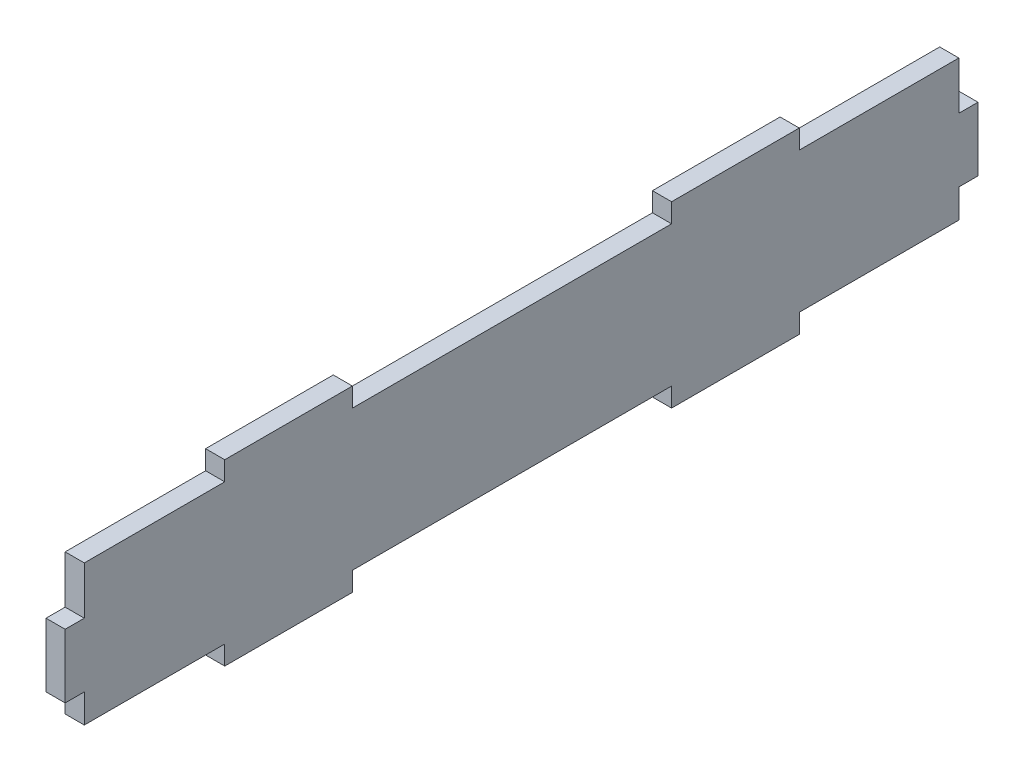
ISO-10303-21;
HEADER;
FILE_DESCRIPTION(('STEP AP214'),'2;1');
FILE_NAME('part.step','',(''),(''),'','','');
FILE_SCHEMA(('AUTOMOTIVE_DESIGN { 1 0 10303 214 1 1 1 1 }'));
ENDSEC;
DATA;
#1=APPLICATION_CONTEXT('core data for automotive mechanical design processes');
#2=APPLICATION_PROTOCOL_DEFINITION('international standard','automotive_design',2000,#1);
#3=PRODUCT_CONTEXT('',#1,'mechanical');
#4=PRODUCT('Part','Part','',(#3));
#5=PRODUCT_RELATED_PRODUCT_CATEGORY('part','',(#4));
#6=PRODUCT_DEFINITION_FORMATION('','',#4);
#7=PRODUCT_DEFINITION_CONTEXT('part definition',#1,'design');
#8=PRODUCT_DEFINITION('design','',#6,#7);
#9=PRODUCT_DEFINITION_SHAPE('','',#8);
#10=(LENGTH_UNIT() NAMED_UNIT(*) SI_UNIT(.MILLI.,.METRE.));
#11=(NAMED_UNIT(*) PLANE_ANGLE_UNIT() SI_UNIT($,.RADIAN.));
#12=(NAMED_UNIT(*) SI_UNIT($,.STERADIAN.) SOLID_ANGLE_UNIT());
#13=UNCERTAINTY_MEASURE_WITH_UNIT(LENGTH_MEASURE(1.E-05),#10,'distance_accuracy_value','');
#14=(GEOMETRIC_REPRESENTATION_CONTEXT(3) GLOBAL_UNCERTAINTY_ASSIGNED_CONTEXT((#13)) GLOBAL_UNIT_ASSIGNED_CONTEXT((#10,
#11,#12)) REPRESENTATION_CONTEXT('',''));
#15=CARTESIAN_POINT('',(0.,0.,0.));
#16=DIRECTION('',(0.,0.,1.));
#17=DIRECTION('',(1.,0.,0.));
#18=AXIS2_PLACEMENT_3D('',#15,#16,#17);
#19=CARTESIAN_POINT('',(135.739907326201,0.,0.));
#20=DIRECTION('',(0.,0.,-1.));
#21=DIRECTION('',(0.,1.,0.));
#22=AXIS2_PLACEMENT_3D('',#19,#20,#21);
#23=PLANE('',#22);
#24=DIRECTION('',(0.,-1.,0.));
#25=VECTOR('',#24,1.);
#26=CARTESIAN_POINT('',(132.739907326201,0.,0.));
#27=LINE('',#26,#25);
#28=CARTESIAN_POINT('',(132.739907326201,17.5,0.));
#29=VERTEX_POINT('',#28);
#30=CARTESIAN_POINT('',(132.739907326201,7.5,0.));
#31=VERTEX_POINT('',#30);
#32=EDGE_CURVE('E253',#29,#31,#27,.T.);
#33=ORIENTED_EDGE('',*,*,#32,.T.);
#34=DIRECTION('',(-1.,0.,0.));
#35=VECTOR('',#34,1.);
#36=CARTESIAN_POINT('',(135.739907326201,7.5,0.));
#37=LINE('',#36,#35);
#38=CARTESIAN_POINT('',(135.739907326201,7.5,0.));
#39=VERTEX_POINT('',#38);
#40=EDGE_CURVE('E11',#39,#31,#37,.T.);
#41=ORIENTED_EDGE('',*,*,#40,.F.);
#42=DIRECTION('',(0.,-1.,0.));
#43=VECTOR('',#42,1.);
#44=CARTESIAN_POINT('',(135.739907326201,0.,0.));
#45=LINE('',#44,#43);
#46=CARTESIAN_POINT('',(135.739907326201,17.5,0.));
#47=VERTEX_POINT('',#46);
#48=EDGE_CURVE('E327',#47,#39,#45,.T.);
#49=ORIENTED_EDGE('',*,*,#48,.F.);
#50=DIRECTION('',(-1.,0.,0.));
#51=VECTOR('',#50,1.);
#52=CARTESIAN_POINT('',(135.739907326201,17.5,0.));
#53=LINE('',#52,#51);
#54=EDGE_CURVE('E50',#47,#29,#53,.T.);
#55=ORIENTED_EDGE('',*,*,#54,.T.);
#56=EDGE_LOOP('',(#33,#41,#49,#55));
#57=FACE_BOUND('',#56,.T.);
#58=ADVANCED_FACE('F34',(#57),#23,.F.);
#59=CARTESIAN_POINT('',(135.739907326201,7.5,0.));
#60=DIRECTION('',(0.,1.,0.));
#61=DIRECTION('',(0.,0.,1.));
#62=AXIS2_PLACEMENT_3D('',#59,#60,#61);
#63=PLANE('',#62);
#64=DIRECTION('',(0.,0.,-1.));
#65=VECTOR('',#64,1.);
#66=CARTESIAN_POINT('',(132.739907326201,7.5,0.));
#67=LINE('',#66,#65);
#68=CARTESIAN_POINT('',(132.739907326201,7.5,-3.00000000000002));
#69=VERTEX_POINT('',#68);
#70=EDGE_CURVE('E255',#31,#69,#67,.T.);
#71=ORIENTED_EDGE('',*,*,#70,.T.);
#72=DIRECTION('',(-1.,0.,0.));
#73=VECTOR('',#72,1.);
#74=CARTESIAN_POINT('',(135.739907326201,7.5,-3.00000000000002));
#75=LINE('',#74,#73);
#76=CARTESIAN_POINT('',(135.739907326201,7.5,-3.00000000000002));
#77=VERTEX_POINT('',#76);
#78=EDGE_CURVE('E42',#77,#69,#75,.T.);
#79=ORIENTED_EDGE('',*,*,#78,.F.);
#80=DIRECTION('',(0.,0.,-1.));
#81=VECTOR('',#80,1.);
#82=CARTESIAN_POINT('',(135.739907326201,7.5,0.));
#83=LINE('',#82,#81);
#84=EDGE_CURVE('E149',#39,#77,#83,.T.);
#85=ORIENTED_EDGE('',*,*,#84,.F.);
#86=ORIENTED_EDGE('',*,*,#40,.T.);
#87=EDGE_LOOP('',(#71,#79,#85,#86));
#88=FACE_BOUND('',#87,.T.);
#89=ADVANCED_FACE('F472',(#88),#63,.F.);
#90=CARTESIAN_POINT('',(135.739907326201,0.,-3.00000000000002));
#91=DIRECTION('',(0.,0.,-1.));
#92=DIRECTION('',(-1.,0.,0.));
#93=AXIS2_PLACEMENT_3D('',#90,#91,#92);
#94=PLANE('',#93);
#95=DIRECTION('',(0.,-1.,0.));
#96=VECTOR('',#95,1.);
#97=CARTESIAN_POINT('',(132.739907326201,0.,-3.00000000000002));
#98=LINE('',#97,#96);
#99=CARTESIAN_POINT('',(132.739907326201,3.,-3.00000000000002));
#100=VERTEX_POINT('',#99);
#101=EDGE_CURVE('E257',#69,#100,#98,.T.);
#102=ORIENTED_EDGE('',*,*,#101,.T.);
#103=DIRECTION('',(-1.,0.,0.));
#104=VECTOR('',#103,1.);
#105=CARTESIAN_POINT('',(135.739907326201,3.,-3.00000000000002));
#106=LINE('',#105,#104);
#107=CARTESIAN_POINT('',(135.739907326201,3.,-3.00000000000002));
#108=VERTEX_POINT('',#107);
#109=EDGE_CURVE('E377',#108,#100,#106,.T.);
#110=ORIENTED_EDGE('',*,*,#109,.F.);
#111=DIRECTION('',(0.,-1.,0.));
#112=VECTOR('',#111,1.);
#113=CARTESIAN_POINT('',(135.739907326201,0.,-3.00000000000002));
#114=LINE('',#113,#112);
#115=EDGE_CURVE('E385',#77,#108,#114,.T.);
#116=ORIENTED_EDGE('',*,*,#115,.F.);
#117=ORIENTED_EDGE('',*,*,#78,.T.);
#118=EDGE_LOOP('',(#102,#110,#116,#117));
#119=FACE_BOUND('',#118,.T.);
#120=ADVANCED_FACE('F383',(#119),#94,.F.);
#121=CARTESIAN_POINT('',(135.739907326201,3.,0.));
#122=DIRECTION('',(0.,1.,0.));
#123=DIRECTION('',(0.,0.,1.));
#124=AXIS2_PLACEMENT_3D('',#121,#122,#123);
#125=PLANE('',#124);
#126=DIRECTION('',(0.,0.,-1.));
#127=VECTOR('',#126,1.);
#128=CARTESIAN_POINT('',(132.739907326201,3.,0.));
#129=LINE('',#128,#127);
#130=CARTESIAN_POINT('',(132.739907326201,3.,-25.));
#131=VERTEX_POINT('',#130);
#132=EDGE_CURVE('E259',#100,#131,#129,.T.);
#133=ORIENTED_EDGE('',*,*,#132,.T.);
#134=DIRECTION('',(-1.,0.,0.));
#135=VECTOR('',#134,1.);
#136=CARTESIAN_POINT('',(135.739907326201,3.,-25.));
#137=LINE('',#136,#135);
#138=CARTESIAN_POINT('',(135.739907326201,3.,-25.));
#139=VERTEX_POINT('',#138);
#140=EDGE_CURVE('E375',#139,#131,#137,.T.);
#141=ORIENTED_EDGE('',*,*,#140,.F.);
#142=DIRECTION('',(0.,0.,-1.));
#143=VECTOR('',#142,1.);
#144=CARTESIAN_POINT('',(135.739907326201,3.,0.));
#145=LINE('',#144,#143);
#146=EDGE_CURVE('E396',#108,#139,#145,.T.);
#147=ORIENTED_EDGE('',*,*,#146,.F.);
#148=ORIENTED_EDGE('',*,*,#109,.T.);
#149=EDGE_LOOP('',(#133,#141,#147,#148));
#150=FACE_BOUND('',#149,.T.);
#151=ADVANCED_FACE('F393',(#150),#125,.F.);
#152=CARTESIAN_POINT('',(135.739907326201,0.,-25.));
#153=DIRECTION('',(0.,0.,1.));
#154=DIRECTION('',(1.,0.,0.));
#155=AXIS2_PLACEMENT_3D('',#152,#153,#154);
#156=PLANE('',#155);
#157=DIRECTION('',(0.,1.,0.));
#158=VECTOR('',#157,1.);
#159=CARTESIAN_POINT('',(132.739907326201,0.,-25.));
#160=LINE('',#159,#158);
#161=CARTESIAN_POINT('',(132.739907326201,0.,-25.));
#162=VERTEX_POINT('',#161);
#163=EDGE_CURVE('E262',#162,#131,#160,.T.);
#164=ORIENTED_EDGE('',*,*,#163,.F.);
#165=DIRECTION('',(-1.,0.,0.));
#166=VECTOR('',#165,1.);
#167=CARTESIAN_POINT('',(135.739907326201,0.,-25.));
#168=LINE('',#167,#166);
#169=CARTESIAN_POINT('',(135.739907326201,0.,-25.));
#170=VERTEX_POINT('',#169);
#171=EDGE_CURVE('E373',#170,#162,#168,.T.);
#172=ORIENTED_EDGE('',*,*,#171,.F.);
#173=DIRECTION('',(0.,1.,0.));
#174=VECTOR('',#173,1.);
#175=CARTESIAN_POINT('',(135.739907326201,0.,-25.));
#176=LINE('',#175,#174);
#177=EDGE_CURVE('E398',#170,#139,#176,.T.);
#178=ORIENTED_EDGE('',*,*,#177,.T.);
#179=ORIENTED_EDGE('',*,*,#140,.T.);
#180=EDGE_LOOP('',(#164,#172,#178,#179));
#181=FACE_BOUND('',#180,.T.);
#182=ADVANCED_FACE('F667',(#181),#156,.T.);
#183=CARTESIAN_POINT('',(135.739907326201,0.,0.));
#184=DIRECTION('',(0.,1.,0.));
#185=DIRECTION('',(0.,0.,1.));
#186=AXIS2_PLACEMENT_3D('',#183,#184,#185);
#187=PLANE('',#186);
#188=DIRECTION('',(0.,0.,-1.));
#189=VECTOR('',#188,1.);
#190=CARTESIAN_POINT('',(132.739907326201,0.,0.));
#191=LINE('',#190,#189);
#192=CARTESIAN_POINT('',(132.739907326201,0.,-45.));
#193=VERTEX_POINT('',#192);
#194=EDGE_CURVE('E265',#162,#193,#191,.T.);
#195=ORIENTED_EDGE('',*,*,#194,.T.);
#196=DIRECTION('',(-1.,0.,0.));
#197=VECTOR('',#196,1.);
#198=CARTESIAN_POINT('',(135.739907326201,0.,-45.));
#199=LINE('',#198,#197);
#200=CARTESIAN_POINT('',(135.739907326201,0.,-45.));
#201=VERTEX_POINT('',#200);
#202=EDGE_CURVE('E370',#201,#193,#199,.T.);
#203=ORIENTED_EDGE('',*,*,#202,.F.);
#204=DIRECTION('',(0.,0.,-1.));
#205=VECTOR('',#204,1.);
#206=CARTESIAN_POINT('',(135.739907326201,0.,0.));
#207=LINE('',#206,#205);
#208=EDGE_CURVE('E400',#170,#201,#207,.T.);
#209=ORIENTED_EDGE('',*,*,#208,.F.);
#210=ORIENTED_EDGE('',*,*,#171,.T.);
#211=EDGE_LOOP('',(#195,#203,#209,#210));
#212=FACE_BOUND('',#211,.T.);
#213=ADVANCED_FACE('F658',(#212),#187,.F.);
#214=CARTESIAN_POINT('',(135.739907326201,0.,-45.));
#215=DIRECTION('',(0.,0.,1.));
#216=DIRECTION('',(1.,0.,0.));
#217=AXIS2_PLACEMENT_3D('',#214,#215,#216);
#218=PLANE('',#217);
#219=DIRECTION('',(0.,1.,0.));
#220=VECTOR('',#219,1.);
#221=CARTESIAN_POINT('',(132.739907326201,0.,-45.));
#222=LINE('',#221,#220);
#223=CARTESIAN_POINT('',(132.739907326201,3.,-45.));
#224=VERTEX_POINT('',#223);
#225=EDGE_CURVE('E267',#193,#224,#222,.T.);
#226=ORIENTED_EDGE('',*,*,#225,.T.);
#227=DIRECTION('',(-1.,0.,0.));
#228=VECTOR('',#227,1.);
#229=CARTESIAN_POINT('',(135.739907326201,3.,-45.));
#230=LINE('',#229,#228);
#231=CARTESIAN_POINT('',(135.739907326201,3.,-45.));
#232=VERTEX_POINT('',#231);
#233=EDGE_CURVE('E367',#232,#224,#230,.T.);
#234=ORIENTED_EDGE('',*,*,#233,.F.);
#235=DIRECTION('',(0.,1.,0.));
#236=VECTOR('',#235,1.);
#237=CARTESIAN_POINT('',(135.739907326201,0.,-45.));
#238=LINE('',#237,#236);
#239=EDGE_CURVE('E406',#201,#232,#238,.T.);
#240=ORIENTED_EDGE('',*,*,#239,.F.);
#241=ORIENTED_EDGE('',*,*,#202,.T.);
#242=EDGE_LOOP('',(#226,#234,#240,#241));
#243=FACE_BOUND('',#242,.T.);
#244=ADVANCED_FACE('F649',(#243),#218,.F.);
#245=CARTESIAN_POINT('',(135.739907326201,3.,0.));
#246=DIRECTION('',(0.,1.,0.));
#247=DIRECTION('',(0.,0.,1.));
#248=AXIS2_PLACEMENT_3D('',#245,#246,#247);
#249=PLANE('',#248);
#250=DIRECTION('',(0.,0.,-1.));
#251=VECTOR('',#250,1.);
#252=CARTESIAN_POINT('',(132.739907326201,3.,0.));
#253=LINE('',#252,#251);
#254=CARTESIAN_POINT('',(132.739907326201,3.,-95.));
#255=VERTEX_POINT('',#254);
#256=EDGE_CURVE('E269',#224,#255,#253,.T.);
#257=ORIENTED_EDGE('',*,*,#256,.T.);
#258=DIRECTION('',(-1.,0.,0.));
#259=VECTOR('',#258,1.);
#260=CARTESIAN_POINT('',(135.739907326201,3.,-95.));
#261=LINE('',#260,#259);
#262=CARTESIAN_POINT('',(135.739907326201,3.,-95.));
#263=VERTEX_POINT('',#262);
#264=EDGE_CURVE('E365',#263,#255,#261,.T.);
#265=ORIENTED_EDGE('',*,*,#264,.F.);
#266=DIRECTION('',(0.,0.,-1.));
#267=VECTOR('',#266,1.);
#268=CARTESIAN_POINT('',(135.739907326201,3.,0.));
#269=LINE('',#268,#267);
#270=EDGE_CURVE('E408',#232,#263,#269,.T.);
#271=ORIENTED_EDGE('',*,*,#270,.F.);
#272=ORIENTED_EDGE('',*,*,#233,.T.);
#273=EDGE_LOOP('',(#257,#265,#271,#272));
#274=FACE_BOUND('',#273,.T.);
#275=ADVANCED_FACE('F640',(#274),#249,.F.);
#276=CARTESIAN_POINT('',(135.739907326201,0.,-95.));
#277=DIRECTION('',(0.,0.,1.));
#278=DIRECTION('',(1.,0.,0.));
#279=AXIS2_PLACEMENT_3D('',#276,#277,#278);
#280=PLANE('',#279);
#281=DIRECTION('',(0.,1.,0.));
#282=VECTOR('',#281,1.);
#283=CARTESIAN_POINT('',(132.739907326201,0.,-95.));
#284=LINE('',#283,#282);
#285=CARTESIAN_POINT('',(132.739907326201,0.,-95.));
#286=VERTEX_POINT('',#285);
#287=EDGE_CURVE('E272',#286,#255,#284,.T.);
#288=ORIENTED_EDGE('',*,*,#287,.F.);
#289=DIRECTION('',(-1.,0.,0.));
#290=VECTOR('',#289,1.);
#291=CARTESIAN_POINT('',(135.739907326201,0.,-95.));
#292=LINE('',#291,#290);
#293=CARTESIAN_POINT('',(135.739907326201,0.,-95.));
#294=VERTEX_POINT('',#293);
#295=EDGE_CURVE('E363',#294,#286,#292,.T.);
#296=ORIENTED_EDGE('',*,*,#295,.F.);
#297=DIRECTION('',(0.,1.,0.));
#298=VECTOR('',#297,1.);
#299=CARTESIAN_POINT('',(135.739907326201,0.,-95.));
#300=LINE('',#299,#298);
#301=EDGE_CURVE('E410',#294,#263,#300,.T.);
#302=ORIENTED_EDGE('',*,*,#301,.T.);
#303=ORIENTED_EDGE('',*,*,#264,.T.);
#304=EDGE_LOOP('',(#288,#296,#302,#303));
#305=FACE_BOUND('',#304,.T.);
#306=ADVANCED_FACE('F631',(#305),#280,.T.);
#307=CARTESIAN_POINT('',(135.739907326201,0.,0.));
#308=DIRECTION('',(0.,1.,0.));
#309=DIRECTION('',(0.,0.,1.));
#310=AXIS2_PLACEMENT_3D('',#307,#308,#309);
#311=PLANE('',#310);
#312=DIRECTION('',(0.,0.,-1.));
#313=VECTOR('',#312,1.);
#314=CARTESIAN_POINT('',(132.739907326201,0.,0.));
#315=LINE('',#314,#313);
#316=CARTESIAN_POINT('',(132.739907326201,0.,-115.));
#317=VERTEX_POINT('',#316);
#318=EDGE_CURVE('E275',#286,#317,#315,.T.);
#319=ORIENTED_EDGE('',*,*,#318,.T.);
#320=DIRECTION('',(-1.,0.,0.));
#321=VECTOR('',#320,1.);
#322=CARTESIAN_POINT('',(135.739907326201,0.,-115.));
#323=LINE('',#322,#321);
#324=CARTESIAN_POINT('',(135.739907326201,0.,-115.));
#325=VERTEX_POINT('',#324);
#326=EDGE_CURVE('E360',#325,#317,#323,.T.);
#327=ORIENTED_EDGE('',*,*,#326,.F.);
#328=DIRECTION('',(0.,0.,-1.));
#329=VECTOR('',#328,1.);
#330=CARTESIAN_POINT('',(135.739907326201,0.,0.));
#331=LINE('',#330,#329);
#332=EDGE_CURVE('E413',#294,#325,#331,.T.);
#333=ORIENTED_EDGE('',*,*,#332,.F.);
#334=ORIENTED_EDGE('',*,*,#295,.T.);
#335=EDGE_LOOP('',(#319,#327,#333,#334));
#336=FACE_BOUND('',#335,.T.);
#337=ADVANCED_FACE('F622',(#336),#311,.F.);
#338=CARTESIAN_POINT('',(135.739907326201,0.,-115.));
#339=DIRECTION('',(0.,0.,1.));
#340=DIRECTION('',(1.,0.,0.));
#341=AXIS2_PLACEMENT_3D('',#338,#339,#340);
#342=PLANE('',#341);
#343=DIRECTION('',(0.,1.,0.));
#344=VECTOR('',#343,1.);
#345=CARTESIAN_POINT('',(132.739907326201,0.,-115.));
#346=LINE('',#345,#344);
#347=CARTESIAN_POINT('',(132.739907326201,3.,-115.));
#348=VERTEX_POINT('',#347);
#349=EDGE_CURVE('E277',#317,#348,#346,.T.);
#350=ORIENTED_EDGE('',*,*,#349,.T.);
#351=DIRECTION('',(-1.,0.,0.));
#352=VECTOR('',#351,1.);
#353=CARTESIAN_POINT('',(135.739907326201,3.,-115.));
#354=LINE('',#353,#352);
#355=CARTESIAN_POINT('',(135.739907326201,3.,-115.));
#356=VERTEX_POINT('',#355);
#357=EDGE_CURVE('E357',#356,#348,#354,.T.);
#358=ORIENTED_EDGE('',*,*,#357,.F.);
#359=DIRECTION('',(0.,1.,0.));
#360=VECTOR('',#359,1.);
#361=CARTESIAN_POINT('',(135.739907326201,0.,-115.));
#362=LINE('',#361,#360);
#363=EDGE_CURVE('E415',#325,#356,#362,.T.);
#364=ORIENTED_EDGE('',*,*,#363,.F.);
#365=ORIENTED_EDGE('',*,*,#326,.T.);
#366=EDGE_LOOP('',(#350,#358,#364,#365));
#367=FACE_BOUND('',#366,.T.);
#368=ADVANCED_FACE('F613',(#367),#342,.F.);
#369=CARTESIAN_POINT('',(135.739907326201,3.,0.));
#370=DIRECTION('',(0.,1.,0.));
#371=DIRECTION('',(0.,0.,1.));
#372=AXIS2_PLACEMENT_3D('',#369,#370,#371);
#373=PLANE('',#372);
#374=DIRECTION('',(0.,0.,-1.));
#375=VECTOR('',#374,1.);
#376=CARTESIAN_POINT('',(132.739907326201,3.,0.));
#377=LINE('',#376,#375);
#378=CARTESIAN_POINT('',(132.739907326201,3.,-140.));
#379=VERTEX_POINT('',#378);
#380=EDGE_CURVE('E279',#348,#379,#377,.T.);
#381=ORIENTED_EDGE('',*,*,#380,.T.);
#382=DIRECTION('',(-1.,0.,0.));
#383=VECTOR('',#382,1.);
#384=CARTESIAN_POINT('',(135.739907326201,3.,-140.));
#385=LINE('',#384,#383);
#386=CARTESIAN_POINT('',(135.739907326201,3.,-140.));
#387=VERTEX_POINT('',#386);
#388=EDGE_CURVE('E355',#387,#379,#385,.T.);
#389=ORIENTED_EDGE('',*,*,#388,.F.);
#390=DIRECTION('',(0.,0.,-1.));
#391=VECTOR('',#390,1.);
#392=CARTESIAN_POINT('',(135.739907326201,3.,0.));
#393=LINE('',#392,#391);
#394=EDGE_CURVE('E417',#356,#387,#393,.T.);
#395=ORIENTED_EDGE('',*,*,#394,.F.);
#396=ORIENTED_EDGE('',*,*,#357,.T.);
#397=EDGE_LOOP('',(#381,#389,#395,#396));
#398=FACE_BOUND('',#397,.T.);
#399=ADVANCED_FACE('F604',(#398),#373,.F.);
#400=CARTESIAN_POINT('',(135.739907326201,0.,-140.));
#401=DIRECTION('',(0.,0.,-1.));
#402=DIRECTION('',(-1.,0.,0.));
#403=AXIS2_PLACEMENT_3D('',#400,#401,#402);
#404=PLANE('',#403);
#405=DIRECTION('',(0.,-1.,0.));
#406=VECTOR('',#405,1.);
#407=CARTESIAN_POINT('',(132.739907326201,0.,-140.));
#408=LINE('',#407,#406);
#409=CARTESIAN_POINT('',(132.739907326201,7.5,-140.));
#410=VERTEX_POINT('',#409);
#411=EDGE_CURVE('E282',#410,#379,#408,.T.);
#412=ORIENTED_EDGE('',*,*,#411,.F.);
#413=DIRECTION('',(-1.,0.,0.));
#414=VECTOR('',#413,1.);
#415=CARTESIAN_POINT('',(135.739907326201,7.5,-140.));
#416=LINE('',#415,#414);
#417=CARTESIAN_POINT('',(135.739907326201,7.5,-140.));
#418=VERTEX_POINT('',#417);
#419=EDGE_CURVE('E353',#418,#410,#416,.T.);
#420=ORIENTED_EDGE('',*,*,#419,.F.);
#421=DIRECTION('',(0.,-1.,0.));
#422=VECTOR('',#421,1.);
#423=CARTESIAN_POINT('',(135.739907326201,0.,-140.));
#424=LINE('',#423,#422);
#425=EDGE_CURVE('E419',#418,#387,#424,.T.);
#426=ORIENTED_EDGE('',*,*,#425,.T.);
#427=ORIENTED_EDGE('',*,*,#388,.T.);
#428=EDGE_LOOP('',(#412,#420,#426,#427));
#429=FACE_BOUND('',#428,.T.);
#430=ADVANCED_FACE('F595',(#429),#404,.T.);
#431=CARTESIAN_POINT('',(135.739907326201,7.49999999999996,0.));
#432=DIRECTION('',(0.,-1.,0.));
#433=DIRECTION('',(0.,0.,-1.));
#434=AXIS2_PLACEMENT_3D('',#431,#432,#433);
#435=PLANE('',#434);
#436=DIRECTION('',(0.,0.,1.));
#437=VECTOR('',#436,1.);
#438=CARTESIAN_POINT('',(132.739907326201,7.49999999999996,0.));
#439=LINE('',#438,#437);
#440=CARTESIAN_POINT('',(132.739907326201,7.5,-143.));
#441=VERTEX_POINT('',#440);
#442=EDGE_CURVE('E285',#441,#410,#439,.T.);
#443=ORIENTED_EDGE('',*,*,#442,.F.);
#444=DIRECTION('',(-1.,0.,0.));
#445=VECTOR('',#444,1.);
#446=CARTESIAN_POINT('',(135.739907326201,7.5,-143.));
#447=LINE('',#446,#445);
#448=CARTESIAN_POINT('',(135.739907326201,7.5,-143.));
#449=VERTEX_POINT('',#448);
#450=EDGE_CURVE('E351',#449,#441,#447,.T.);
#451=ORIENTED_EDGE('',*,*,#450,.F.);
#452=DIRECTION('',(0.,0.,1.));
#453=VECTOR('',#452,1.);
#454=CARTESIAN_POINT('',(135.739907326201,7.49999999999996,0.));
#455=LINE('',#454,#453);
#456=EDGE_CURVE('E422',#449,#418,#455,.T.);
#457=ORIENTED_EDGE('',*,*,#456,.T.);
#458=ORIENTED_EDGE('',*,*,#419,.T.);
#459=EDGE_LOOP('',(#443,#451,#457,#458));
#460=FACE_BOUND('',#459,.T.);
#461=ADVANCED_FACE('F586',(#460),#435,.T.);
#462=CARTESIAN_POINT('',(135.739907326201,0.,-143.));
#463=DIRECTION('',(0.,0.,-1.));
#464=DIRECTION('',(-1.,0.,0.));
#465=AXIS2_PLACEMENT_3D('',#462,#463,#464);
#466=PLANE('',#465);
#467=DIRECTION('',(0.,-1.,0.));
#468=VECTOR('',#467,1.);
#469=CARTESIAN_POINT('',(132.739907326201,0.,-143.));
#470=LINE('',#469,#468);
#471=CARTESIAN_POINT('',(132.739907326201,17.5,-143.));
#472=VERTEX_POINT('',#471);
#473=EDGE_CURVE('E288',#472,#441,#470,.T.);
#474=ORIENTED_EDGE('',*,*,#473,.F.);
#475=DIRECTION('',(-1.,0.,0.));
#476=VECTOR('',#475,1.);
#477=CARTESIAN_POINT('',(135.739907326201,17.5,-143.));
#478=LINE('',#477,#476);
#479=CARTESIAN_POINT('',(135.739907326201,17.5,-143.));
#480=VERTEX_POINT('',#479);
#481=EDGE_CURVE('E349',#480,#472,#478,.T.);
#482=ORIENTED_EDGE('',*,*,#481,.F.);
#483=DIRECTION('',(0.,-1.,0.));
#484=VECTOR('',#483,1.);
#485=CARTESIAN_POINT('',(135.739907326201,0.,-143.));
#486=LINE('',#485,#484);
#487=EDGE_CURVE('E425',#480,#449,#486,.T.);
#488=ORIENTED_EDGE('',*,*,#487,.T.);
#489=ORIENTED_EDGE('',*,*,#450,.T.);
#490=EDGE_LOOP('',(#474,#482,#488,#489));
#491=FACE_BOUND('',#490,.T.);
#492=ADVANCED_FACE('F576',(#491),#466,.T.);
#493=CARTESIAN_POINT('',(135.739907326201,17.5,0.));
#494=DIRECTION('',(0.,1.,0.));
#495=DIRECTION('',(0.,0.,1.));
#496=AXIS2_PLACEMENT_3D('',#493,#494,#495);
#497=PLANE('',#496);
#498=DIRECTION('',(0.,0.,-1.));
#499=VECTOR('',#498,1.);
#500=CARTESIAN_POINT('',(132.739907326201,17.5,0.));
#501=LINE('',#500,#499);
#502=CARTESIAN_POINT('',(132.739907326201,17.5,-140.));
#503=VERTEX_POINT('',#502);
#504=EDGE_CURVE('E291',#503,#472,#501,.T.);
#505=ORIENTED_EDGE('',*,*,#504,.F.);
#506=DIRECTION('',(-1.,0.,0.));
#507=VECTOR('',#506,1.);
#508=CARTESIAN_POINT('',(135.739907326201,17.5,-140.));
#509=LINE('',#508,#507);
#510=CARTESIAN_POINT('',(135.739907326201,17.5,-140.));
#511=VERTEX_POINT('',#510);
#512=EDGE_CURVE('E347',#511,#503,#509,.T.);
#513=ORIENTED_EDGE('',*,*,#512,.F.);
#514=DIRECTION('',(0.,0.,-1.));
#515=VECTOR('',#514,1.);
#516=CARTESIAN_POINT('',(135.739907326201,17.5,0.));
#517=LINE('',#516,#515);
#518=EDGE_CURVE('E428',#511,#480,#517,.T.);
#519=ORIENTED_EDGE('',*,*,#518,.T.);
#520=ORIENTED_EDGE('',*,*,#481,.T.);
#521=EDGE_LOOP('',(#505,#513,#519,#520));
#522=FACE_BOUND('',#521,.T.);
#523=ADVANCED_FACE('F567',(#522),#497,.T.);
#524=CARTESIAN_POINT('',(135.739907326201,0.,-140.));
#525=DIRECTION('',(0.,0.,-1.));
#526=DIRECTION('',(-1.,0.,0.));
#527=AXIS2_PLACEMENT_3D('',#524,#525,#526);
#528=PLANE('',#527);
#529=DIRECTION('',(0.,-1.,0.));
#530=VECTOR('',#529,1.);
#531=CARTESIAN_POINT('',(132.739907326201,0.,-140.));
#532=LINE('',#531,#530);
#533=CARTESIAN_POINT('',(132.739907326201,25.,-140.));
#534=VERTEX_POINT('',#533);
#535=EDGE_CURVE('E294',#534,#503,#532,.T.);
#536=ORIENTED_EDGE('',*,*,#535,.F.);
#537=DIRECTION('',(-1.,0.,0.));
#538=VECTOR('',#537,1.);
#539=CARTESIAN_POINT('',(135.739907326201,25.,-140.));
#540=LINE('',#539,#538);
#541=CARTESIAN_POINT('',(135.739907326201,25.,-140.));
#542=VERTEX_POINT('',#541);
#543=EDGE_CURVE('E345',#542,#534,#540,.T.);
#544=ORIENTED_EDGE('',*,*,#543,.F.);
#545=DIRECTION('',(0.,-1.,0.));
#546=VECTOR('',#545,1.);
#547=CARTESIAN_POINT('',(135.739907326201,0.,-140.));
#548=LINE('',#547,#546);
#549=EDGE_CURVE('E431',#542,#511,#548,.T.);
#550=ORIENTED_EDGE('',*,*,#549,.T.);
#551=ORIENTED_EDGE('',*,*,#512,.T.);
#552=EDGE_LOOP('',(#536,#544,#550,#551));
#553=FACE_BOUND('',#552,.T.);
#554=ADVANCED_FACE('F558',(#553),#528,.T.);
#555=CARTESIAN_POINT('',(135.739907326201,25.,0.));
#556=DIRECTION('',(0.,1.,0.));
#557=DIRECTION('',(0.,0.,1.));
#558=AXIS2_PLACEMENT_3D('',#555,#556,#557);
#559=PLANE('',#558);
#560=DIRECTION('',(0.,0.,-1.));
#561=VECTOR('',#560,1.);
#562=CARTESIAN_POINT('',(132.739907326201,25.,0.));
#563=LINE('',#562,#561);
#564=CARTESIAN_POINT('',(132.739907326201,25.,-115.));
#565=VERTEX_POINT('',#564);
#566=EDGE_CURVE('E297',#565,#534,#563,.T.);
#567=ORIENTED_EDGE('',*,*,#566,.F.);
#568=DIRECTION('',(-1.,0.,0.));
#569=VECTOR('',#568,1.);
#570=CARTESIAN_POINT('',(135.739907326201,25.,-115.));
#571=LINE('',#570,#569);
#572=CARTESIAN_POINT('',(135.739907326201,25.,-115.));
#573=VERTEX_POINT('',#572);
#574=EDGE_CURVE('E343',#573,#565,#571,.T.);
#575=ORIENTED_EDGE('',*,*,#574,.F.);
#576=DIRECTION('',(0.,0.,-1.));
#577=VECTOR('',#576,1.);
#578=CARTESIAN_POINT('',(135.739907326201,25.,0.));
#579=LINE('',#578,#577);
#580=EDGE_CURVE('E434',#573,#542,#579,.T.);
#581=ORIENTED_EDGE('',*,*,#580,.T.);
#582=ORIENTED_EDGE('',*,*,#543,.T.);
#583=EDGE_LOOP('',(#567,#575,#581,#582));
#584=FACE_BOUND('',#583,.T.);
#585=ADVANCED_FACE('F549',(#584),#559,.T.);
#586=CARTESIAN_POINT('',(135.739907326201,0.,-115.));
#587=DIRECTION('',(0.,0.,-1.));
#588=DIRECTION('',(-1.,0.,0.));
#589=AXIS2_PLACEMENT_3D('',#586,#587,#588);
#590=PLANE('',#589);
#591=DIRECTION('',(0.,-1.,0.));
#592=VECTOR('',#591,1.);
#593=CARTESIAN_POINT('',(132.739907326201,0.,-115.));
#594=LINE('',#593,#592);
#595=CARTESIAN_POINT('',(132.739907326201,28.,-115.));
#596=VERTEX_POINT('',#595);
#597=EDGE_CURVE('E300',#596,#565,#594,.T.);
#598=ORIENTED_EDGE('',*,*,#597,.F.);
#599=DIRECTION('',(-1.,0.,0.));
#600=VECTOR('',#599,1.);
#601=CARTESIAN_POINT('',(135.739907326201,28.,-115.));
#602=LINE('',#601,#600);
#603=CARTESIAN_POINT('',(135.739907326201,28.,-115.));
#604=VERTEX_POINT('',#603);
#605=EDGE_CURVE('E341',#604,#596,#602,.T.);
#606=ORIENTED_EDGE('',*,*,#605,.F.);
#607=DIRECTION('',(0.,-1.,0.));
#608=VECTOR('',#607,1.);
#609=CARTESIAN_POINT('',(135.739907326201,0.,-115.));
#610=LINE('',#609,#608);
#611=EDGE_CURVE('E437',#604,#573,#610,.T.);
#612=ORIENTED_EDGE('',*,*,#611,.T.);
#613=ORIENTED_EDGE('',*,*,#574,.T.);
#614=EDGE_LOOP('',(#598,#606,#612,#613));
#615=FACE_BOUND('',#614,.T.);
#616=ADVANCED_FACE('F540',(#615),#590,.T.);
#617=CARTESIAN_POINT('',(135.739907326201,28.,0.));
#618=DIRECTION('',(0.,1.,0.));
#619=DIRECTION('',(0.,0.,1.));
#620=AXIS2_PLACEMENT_3D('',#617,#618,#619);
#621=PLANE('',#620);
#622=DIRECTION('',(0.,0.,-1.));
#623=VECTOR('',#622,1.);
#624=CARTESIAN_POINT('',(132.739907326201,28.,0.));
#625=LINE('',#624,#623);
#626=CARTESIAN_POINT('',(132.739907326201,28.,-95.));
#627=VERTEX_POINT('',#626);
#628=EDGE_CURVE('E303',#627,#596,#625,.T.);
#629=ORIENTED_EDGE('',*,*,#628,.F.);
#630=DIRECTION('',(-1.,0.,0.));
#631=VECTOR('',#630,1.);
#632=CARTESIAN_POINT('',(135.739907326201,28.,-95.));
#633=LINE('',#632,#631);
#634=CARTESIAN_POINT('',(135.739907326201,28.,-95.));
#635=VERTEX_POINT('',#634);
#636=EDGE_CURVE('E339',#635,#627,#633,.T.);
#637=ORIENTED_EDGE('',*,*,#636,.F.);
#638=DIRECTION('',(0.,0.,-1.));
#639=VECTOR('',#638,1.);
#640=CARTESIAN_POINT('',(135.739907326201,28.,0.));
#641=LINE('',#640,#639);
#642=EDGE_CURVE('E440',#635,#604,#641,.T.);
#643=ORIENTED_EDGE('',*,*,#642,.T.);
#644=ORIENTED_EDGE('',*,*,#605,.T.);
#645=EDGE_LOOP('',(#629,#637,#643,#644));
#646=FACE_BOUND('',#645,.T.);
#647=ADVANCED_FACE('F531',(#646),#621,.T.);
#648=CARTESIAN_POINT('',(135.739907326201,0.,-95.));
#649=DIRECTION('',(0.,0.,-1.));
#650=DIRECTION('',(-1.,0.,0.));
#651=AXIS2_PLACEMENT_3D('',#648,#649,#650);
#652=PLANE('',#651);
#653=DIRECTION('',(0.,-1.,0.));
#654=VECTOR('',#653,1.);
#655=CARTESIAN_POINT('',(132.739907326201,0.,-95.));
#656=LINE('',#655,#654);
#657=CARTESIAN_POINT('',(132.739907326201,25.,-95.));
#658=VERTEX_POINT('',#657);
#659=EDGE_CURVE('E306',#627,#658,#656,.T.);
#660=ORIENTED_EDGE('',*,*,#659,.T.);
#661=DIRECTION('',(-1.,0.,0.));
#662=VECTOR('',#661,1.);
#663=CARTESIAN_POINT('',(135.739907326201,25.,-95.));
#664=LINE('',#663,#662);
#665=CARTESIAN_POINT('',(135.739907326201,25.,-95.));
#666=VERTEX_POINT('',#665);
#667=EDGE_CURVE('E337',#666,#658,#664,.T.);
#668=ORIENTED_EDGE('',*,*,#667,.F.);
#669=DIRECTION('',(0.,-1.,0.));
#670=VECTOR('',#669,1.);
#671=CARTESIAN_POINT('',(135.739907326201,0.,-95.));
#672=LINE('',#671,#670);
#673=EDGE_CURVE('E443',#635,#666,#672,.T.);
#674=ORIENTED_EDGE('',*,*,#673,.F.);
#675=ORIENTED_EDGE('',*,*,#636,.T.);
#676=EDGE_LOOP('',(#660,#668,#674,#675));
#677=FACE_BOUND('',#676,.T.);
#678=ADVANCED_FACE('F522',(#677),#652,.F.);
#679=CARTESIAN_POINT('',(135.739907326201,25.,0.));
#680=DIRECTION('',(0.,1.,0.));
#681=DIRECTION('',(0.,0.,1.));
#682=AXIS2_PLACEMENT_3D('',#679,#680,#681);
#683=PLANE('',#682);
#684=DIRECTION('',(0.,0.,-1.));
#685=VECTOR('',#684,1.);
#686=CARTESIAN_POINT('',(132.739907326201,25.,0.));
#687=LINE('',#686,#685);
#688=CARTESIAN_POINT('',(132.739907326201,25.,-45.));
#689=VERTEX_POINT('',#688);
#690=EDGE_CURVE('E309',#689,#658,#687,.T.);
#691=ORIENTED_EDGE('',*,*,#690,.F.);
#692=DIRECTION('',(-1.,0.,0.));
#693=VECTOR('',#692,1.);
#694=CARTESIAN_POINT('',(135.739907326201,25.,-45.));
#695=LINE('',#694,#693);
#696=CARTESIAN_POINT('',(135.739907326201,25.,-45.));
#697=VERTEX_POINT('',#696);
#698=EDGE_CURVE('E335',#697,#689,#695,.T.);
#699=ORIENTED_EDGE('',*,*,#698,.F.);
#700=DIRECTION('',(0.,0.,-1.));
#701=VECTOR('',#700,1.);
#702=CARTESIAN_POINT('',(135.739907326201,25.,0.));
#703=LINE('',#702,#701);
#704=EDGE_CURVE('E445',#697,#666,#703,.T.);
#705=ORIENTED_EDGE('',*,*,#704,.T.);
#706=ORIENTED_EDGE('',*,*,#667,.T.);
#707=EDGE_LOOP('',(#691,#699,#705,#706));
#708=FACE_BOUND('',#707,.T.);
#709=ADVANCED_FACE('F513',(#708),#683,.T.);
#710=CARTESIAN_POINT('',(135.739907326201,0.,-45.));
#711=DIRECTION('',(0.,0.,-1.));
#712=DIRECTION('',(-1.,0.,0.));
#713=AXIS2_PLACEMENT_3D('',#710,#711,#712);
#714=PLANE('',#713);
#715=DIRECTION('',(0.,-1.,0.));
#716=VECTOR('',#715,1.);
#717=CARTESIAN_POINT('',(132.739907326201,0.,-45.));
#718=LINE('',#717,#716);
#719=CARTESIAN_POINT('',(132.739907326201,28.,-45.));
#720=VERTEX_POINT('',#719);
#721=EDGE_CURVE('E312',#720,#689,#718,.T.);
#722=ORIENTED_EDGE('',*,*,#721,.F.);
#723=DIRECTION('',(-1.,0.,0.));
#724=VECTOR('',#723,1.);
#725=CARTESIAN_POINT('',(135.739907326201,28.,-45.));
#726=LINE('',#725,#724);
#727=CARTESIAN_POINT('',(135.739907326201,28.,-45.));
#728=VERTEX_POINT('',#727);
#729=EDGE_CURVE('E333',#728,#720,#726,.T.);
#730=ORIENTED_EDGE('',*,*,#729,.F.);
#731=DIRECTION('',(0.,-1.,0.));
#732=VECTOR('',#731,1.);
#733=CARTESIAN_POINT('',(135.739907326201,0.,-45.));
#734=LINE('',#733,#732);
#735=EDGE_CURVE('E448',#728,#697,#734,.T.);
#736=ORIENTED_EDGE('',*,*,#735,.T.);
#737=ORIENTED_EDGE('',*,*,#698,.T.);
#738=EDGE_LOOP('',(#722,#730,#736,#737));
#739=FACE_BOUND('',#738,.T.);
#740=ADVANCED_FACE('F458',(#739),#714,.T.);
#741=CARTESIAN_POINT('',(135.739907326201,28.,0.));
#742=DIRECTION('',(0.,1.,0.));
#743=DIRECTION('',(0.,0.,1.));
#744=AXIS2_PLACEMENT_3D('',#741,#742,#743);
#745=PLANE('',#744);
#746=DIRECTION('',(0.,0.,-1.));
#747=VECTOR('',#746,1.);
#748=CARTESIAN_POINT('',(132.739907326201,28.,0.));
#749=LINE('',#748,#747);
#750=CARTESIAN_POINT('',(132.739907326201,28.,-25.));
#751=VERTEX_POINT('',#750);
#752=EDGE_CURVE('E315',#751,#720,#749,.T.);
#753=ORIENTED_EDGE('',*,*,#752,.F.);
#754=DIRECTION('',(-1.,0.,0.));
#755=VECTOR('',#754,1.);
#756=CARTESIAN_POINT('',(135.739907326201,28.,-25.));
#757=LINE('',#756,#755);
#758=CARTESIAN_POINT('',(135.739907326201,28.,-25.));
#759=VERTEX_POINT('',#758);
#760=EDGE_CURVE('E331',#759,#751,#757,.T.);
#761=ORIENTED_EDGE('',*,*,#760,.F.);
#762=DIRECTION('',(0.,0.,-1.));
#763=VECTOR('',#762,1.);
#764=CARTESIAN_POINT('',(135.739907326201,28.,0.));
#765=LINE('',#764,#763);
#766=EDGE_CURVE('E248',#759,#728,#765,.T.);
#767=ORIENTED_EDGE('',*,*,#766,.T.);
#768=ORIENTED_EDGE('',*,*,#729,.T.);
#769=EDGE_LOOP('',(#753,#761,#767,#768));
#770=FACE_BOUND('',#769,.T.);
#771=ADVANCED_FACE('F453',(#770),#745,.T.);
#772=CARTESIAN_POINT('',(135.739907326201,0.,-25.));
#773=DIRECTION('',(0.,0.,-1.));
#774=DIRECTION('',(-1.,0.,0.));
#775=AXIS2_PLACEMENT_3D('',#772,#773,#774);
#776=PLANE('',#775);
#777=DIRECTION('',(0.,-1.,0.));
#778=VECTOR('',#777,1.);
#779=CARTESIAN_POINT('',(132.739907326201,0.,-25.));
#780=LINE('',#779,#778);
#781=CARTESIAN_POINT('',(132.739907326201,25.,-25.));
#782=VERTEX_POINT('',#781);
#783=EDGE_CURVE('E318',#751,#782,#780,.T.);
#784=ORIENTED_EDGE('',*,*,#783,.T.);
#785=DIRECTION('',(-1.,0.,0.));
#786=VECTOR('',#785,1.);
#787=CARTESIAN_POINT('',(135.739907326201,25.,-25.));
#788=LINE('',#787,#786);
#789=CARTESIAN_POINT('',(135.739907326201,25.,-25.));
#790=VERTEX_POINT('',#789);
#791=EDGE_CURVE('E234',#790,#782,#788,.T.);
#792=ORIENTED_EDGE('',*,*,#791,.F.);
#793=DIRECTION('',(0.,-1.,0.));
#794=VECTOR('',#793,1.);
#795=CARTESIAN_POINT('',(135.739907326201,0.,-25.));
#796=LINE('',#795,#794);
#797=EDGE_CURVE('E245',#759,#790,#796,.T.);
#798=ORIENTED_EDGE('',*,*,#797,.F.);
#799=ORIENTED_EDGE('',*,*,#760,.T.);
#800=EDGE_LOOP('',(#784,#792,#798,#799));
#801=FACE_BOUND('',#800,.T.);
#802=ADVANCED_FACE('F462',(#801),#776,.F.);
#803=CARTESIAN_POINT('',(135.739907326201,25.,0.));
#804=DIRECTION('',(0.,1.,0.));
#805=DIRECTION('',(0.,0.,1.));
#806=AXIS2_PLACEMENT_3D('',#803,#804,#805);
#807=PLANE('',#806);
#808=DIRECTION('',(0.,0.,-1.));
#809=VECTOR('',#808,1.);
#810=CARTESIAN_POINT('',(132.739907326201,25.,0.));
#811=LINE('',#810,#809);
#812=CARTESIAN_POINT('',(132.739907326201,25.,-3.00000000000002));
#813=VERTEX_POINT('',#812);
#814=EDGE_CURVE('E231',#813,#782,#811,.T.);
#815=ORIENTED_EDGE('',*,*,#814,.F.);
#816=DIRECTION('',(-1.,0.,0.));
#817=VECTOR('',#816,1.);
#818=CARTESIAN_POINT('',(135.739907326201,25.,-3.00000000000002));
#819=LINE('',#818,#817);
#820=CARTESIAN_POINT('',(135.739907326201,25.,-3.00000000000002));
#821=VERTEX_POINT('',#820);
#822=EDGE_CURVE('E225',#821,#813,#819,.T.);
#823=ORIENTED_EDGE('',*,*,#822,.F.);
#824=DIRECTION('',(0.,0.,-1.));
#825=VECTOR('',#824,1.);
#826=CARTESIAN_POINT('',(135.739907326201,25.,0.));
#827=LINE('',#826,#825);
#828=EDGE_CURVE('E229',#821,#790,#827,.T.);
#829=ORIENTED_EDGE('',*,*,#828,.T.);
#830=ORIENTED_EDGE('',*,*,#791,.T.);
#831=EDGE_LOOP('',(#815,#823,#829,#830));
#832=FACE_BOUND('',#831,.T.);
#833=ADVANCED_FACE('F227',(#832),#807,.T.);
#834=CARTESIAN_POINT('',(135.739907326201,0.,-3.00000000000001));
#835=DIRECTION('',(0.,0.,-1.));
#836=DIRECTION('',(0.,1.,0.));
#837=AXIS2_PLACEMENT_3D('',#834,#835,#836);
#838=PLANE('',#837);
#839=DIRECTION('',(0.,-1.,0.));
#840=VECTOR('',#839,1.);
#841=CARTESIAN_POINT('',(132.739907326201,0.,-3.00000000000001));
#842=LINE('',#841,#840);
#843=CARTESIAN_POINT('',(132.739907326201,17.5,-3.00000000000002));
#844=VERTEX_POINT('',#843);
#845=EDGE_CURVE('E322',#813,#844,#842,.T.);
#846=ORIENTED_EDGE('',*,*,#845,.T.);
#847=DIRECTION('',(-1.,0.,0.));
#848=VECTOR('',#847,1.);
#849=CARTESIAN_POINT('',(135.739907326201,17.5,-3.00000000000002));
#850=LINE('',#849,#848);
#851=CARTESIAN_POINT('',(135.739907326201,17.5,-3.00000000000002));
#852=VERTEX_POINT('',#851);
#853=EDGE_CURVE('E137',#852,#844,#850,.T.);
#854=ORIENTED_EDGE('',*,*,#853,.F.);
#855=DIRECTION('',(0.,-1.,0.));
#856=VECTOR('',#855,1.);
#857=CARTESIAN_POINT('',(135.739907326201,0.,-3.00000000000001));
#858=LINE('',#857,#856);
#859=EDGE_CURVE('E236',#821,#852,#858,.T.);
#860=ORIENTED_EDGE('',*,*,#859,.F.);
#861=ORIENTED_EDGE('',*,*,#822,.T.);
#862=EDGE_LOOP('',(#846,#854,#860,#861));
#863=FACE_BOUND('',#862,.T.);
#864=ADVANCED_FACE('F237',(#863),#838,.F.);
#865=CARTESIAN_POINT('',(135.739907326201,17.5,0.));
#866=DIRECTION('',(0.,1.,0.));
#867=DIRECTION('',(0.,0.,1.));
#868=AXIS2_PLACEMENT_3D('',#865,#866,#867);
#869=PLANE('',#868);
#870=DIRECTION('',(0.,0.,-1.));
#871=VECTOR('',#870,1.);
#872=CARTESIAN_POINT('',(132.739907326201,17.5,0.));
#873=LINE('',#872,#871);
#874=EDGE_CURVE('E324',#29,#844,#873,.T.);
#875=ORIENTED_EDGE('',*,*,#874,.F.);
#876=ORIENTED_EDGE('',*,*,#54,.F.);
#877=DIRECTION('',(0.,0.,-1.));
#878=VECTOR('',#877,1.);
#879=CARTESIAN_POINT('',(135.739907326201,17.5,0.));
#880=LINE('',#879,#878);
#881=EDGE_CURVE('E240',#47,#852,#880,.T.);
#882=ORIENTED_EDGE('',*,*,#881,.T.);
#883=ORIENTED_EDGE('',*,*,#853,.T.);
#884=EDGE_LOOP('',(#875,#876,#882,#883));
#885=FACE_BOUND('',#884,.T.);
#886=ADVANCED_FACE('F477',(#885),#869,.T.);
#887=CARTESIAN_POINT('',(135.739907326201,0.,0.));
#888=DIRECTION('',(1.,0.,0.));
#889=DIRECTION('',(0.,0.,-1.));
#890=AXIS2_PLACEMENT_3D('',#887,#888,#889);
#891=PLANE('',#890);
#892=ORIENTED_EDGE('',*,*,#48,.T.);
#893=ORIENTED_EDGE('',*,*,#84,.T.);
#894=ORIENTED_EDGE('',*,*,#115,.T.);
#895=ORIENTED_EDGE('',*,*,#146,.T.);
#896=ORIENTED_EDGE('',*,*,#177,.F.);
#897=ORIENTED_EDGE('',*,*,#208,.T.);
#898=ORIENTED_EDGE('',*,*,#239,.T.);
#899=ORIENTED_EDGE('',*,*,#270,.T.);
#900=ORIENTED_EDGE('',*,*,#301,.F.);
#901=ORIENTED_EDGE('',*,*,#332,.T.);
#902=ORIENTED_EDGE('',*,*,#363,.T.);
#903=ORIENTED_EDGE('',*,*,#394,.T.);
#904=ORIENTED_EDGE('',*,*,#425,.F.);
#905=ORIENTED_EDGE('',*,*,#456,.F.);
#906=ORIENTED_EDGE('',*,*,#487,.F.);
#907=ORIENTED_EDGE('',*,*,#518,.F.);
#908=ORIENTED_EDGE('',*,*,#549,.F.);
#909=ORIENTED_EDGE('',*,*,#580,.F.);
#910=ORIENTED_EDGE('',*,*,#611,.F.);
#911=ORIENTED_EDGE('',*,*,#642,.F.);
#912=ORIENTED_EDGE('',*,*,#673,.T.);
#913=ORIENTED_EDGE('',*,*,#704,.F.);
#914=ORIENTED_EDGE('',*,*,#735,.F.);
#915=ORIENTED_EDGE('',*,*,#766,.F.);
#916=ORIENTED_EDGE('',*,*,#797,.T.);
#917=ORIENTED_EDGE('',*,*,#828,.F.);
#918=ORIENTED_EDGE('',*,*,#859,.T.);
#919=ORIENTED_EDGE('',*,*,#881,.F.);
#920=EDGE_LOOP('',(#892,#893,#894,#895,#896,#897,#898,#899,#900,#901,#902,#903,#904,#905,#906,
#907,#908,#909,#910,#911,#912,#913,#914,#915,#916,#917,#918,#919));
#921=FACE_BOUND('',#920,.T.);
#922=ADVANCED_FACE('F242',(#921),#891,.T.);
#923=CARTESIAN_POINT('',(132.739907326201,0.,0.));
#924=DIRECTION('',(1.,0.,0.));
#925=DIRECTION('',(0.,0.,-1.));
#926=AXIS2_PLACEMENT_3D('',#923,#924,#925);
#927=PLANE('',#926);
#928=ORIENTED_EDGE('',*,*,#32,.F.);
#929=ORIENTED_EDGE('',*,*,#874,.T.);
#930=ORIENTED_EDGE('',*,*,#845,.F.);
#931=ORIENTED_EDGE('',*,*,#814,.T.);
#932=ORIENTED_EDGE('',*,*,#783,.F.);
#933=ORIENTED_EDGE('',*,*,#752,.T.);
#934=ORIENTED_EDGE('',*,*,#721,.T.);
#935=ORIENTED_EDGE('',*,*,#690,.T.);
#936=ORIENTED_EDGE('',*,*,#659,.F.);
#937=ORIENTED_EDGE('',*,*,#628,.T.);
#938=ORIENTED_EDGE('',*,*,#597,.T.);
#939=ORIENTED_EDGE('',*,*,#566,.T.);
#940=ORIENTED_EDGE('',*,*,#535,.T.);
#941=ORIENTED_EDGE('',*,*,#504,.T.);
#942=ORIENTED_EDGE('',*,*,#473,.T.);
#943=ORIENTED_EDGE('',*,*,#442,.T.);
#944=ORIENTED_EDGE('',*,*,#411,.T.);
#945=ORIENTED_EDGE('',*,*,#380,.F.);
#946=ORIENTED_EDGE('',*,*,#349,.F.);
#947=ORIENTED_EDGE('',*,*,#318,.F.);
#948=ORIENTED_EDGE('',*,*,#287,.T.);
#949=ORIENTED_EDGE('',*,*,#256,.F.);
#950=ORIENTED_EDGE('',*,*,#225,.F.);
#951=ORIENTED_EDGE('',*,*,#194,.F.);
#952=ORIENTED_EDGE('',*,*,#163,.T.);
#953=ORIENTED_EDGE('',*,*,#132,.F.);
#954=ORIENTED_EDGE('',*,*,#101,.F.);
#955=ORIENTED_EDGE('',*,*,#70,.F.);
#956=EDGE_LOOP('',(#928,#929,#930,#931,#932,#933,#934,#935,#936,#937,#938,#939,#940,#941,#942,
#943,#944,#945,#946,#947,#948,#949,#950,#951,#952,#953,#954,#955));
#957=FACE_BOUND('',#956,.T.);
#958=ADVANCED_FACE('F388',(#957),#927,.F.);
#959=CLOSED_SHELL('',(#58,#89,#120,#151,#182,#213,#244,#275,#306,#337,#368,#399,#430,#461,#492,
#523,#554,#585,#616,#647,#678,#709,#740,#771,#802,#833,#864,#886,#922,#958));
#960=MANIFOLD_SOLID_BREP('B2',#959);
#961=ADVANCED_BREP_SHAPE_REPRESENTATION('',(#18,#960),#14);
#962=SHAPE_DEFINITION_REPRESENTATION(#9,#961);
ENDSEC;
END-ISO-10303-21;
